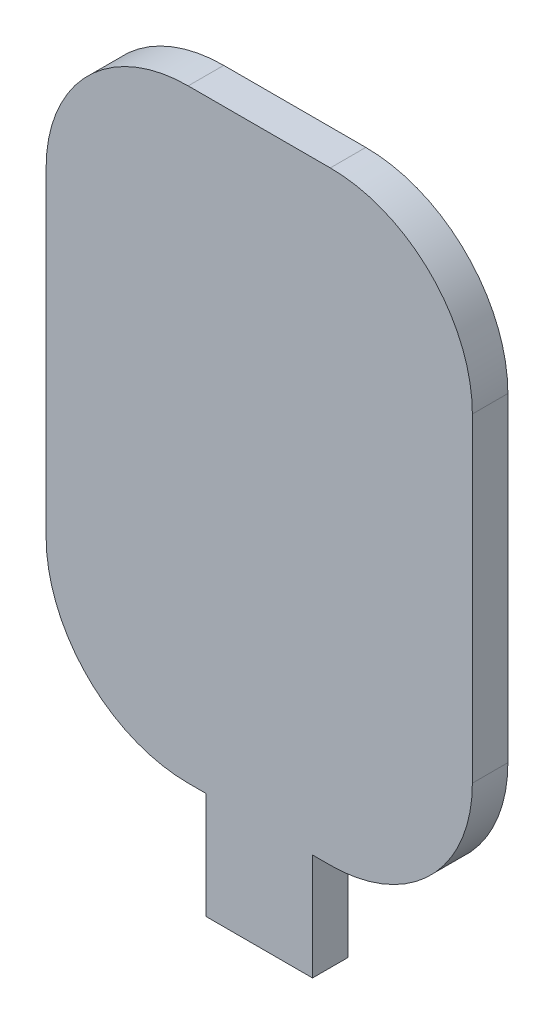
ISO-10303-21;
HEADER;
FILE_DESCRIPTION(('STEP AP214'),'2;1');
FILE_NAME('part.step','',(''),(''),'','','');
FILE_SCHEMA(('AUTOMOTIVE_DESIGN { 1 0 10303 214 1 1 1 1 }'));
ENDSEC;
DATA;
#1=APPLICATION_CONTEXT('core data for automotive mechanical design processes');
#2=APPLICATION_PROTOCOL_DEFINITION('international standard','automotive_design',2000,#1);
#3=PRODUCT_CONTEXT('',#1,'mechanical');
#4=PRODUCT('Part','Part','',(#3));
#5=PRODUCT_RELATED_PRODUCT_CATEGORY('part','',(#4));
#6=PRODUCT_DEFINITION_FORMATION('','',#4);
#7=PRODUCT_DEFINITION_CONTEXT('part definition',#1,'design');
#8=PRODUCT_DEFINITION('design','',#6,#7);
#9=PRODUCT_DEFINITION_SHAPE('','',#8);
#10=(LENGTH_UNIT() NAMED_UNIT(*) SI_UNIT(.MILLI.,.METRE.));
#11=(NAMED_UNIT(*) PLANE_ANGLE_UNIT() SI_UNIT($,.RADIAN.));
#12=(NAMED_UNIT(*) SI_UNIT($,.STERADIAN.) SOLID_ANGLE_UNIT());
#13=UNCERTAINTY_MEASURE_WITH_UNIT(LENGTH_MEASURE(1.E-05),#10,'distance_accuracy_value','');
#14=(GEOMETRIC_REPRESENTATION_CONTEXT(3) GLOBAL_UNCERTAINTY_ASSIGNED_CONTEXT((#13)) GLOBAL_UNIT_ASSIGNED_CONTEXT((#10,
#11,#12)) REPRESENTATION_CONTEXT('',''));
#15=CARTESIAN_POINT('',(0.,0.,0.));
#16=DIRECTION('',(0.,0.,1.));
#17=DIRECTION('',(1.,0.,0.));
#18=AXIS2_PLACEMENT_3D('',#15,#16,#17);
#19=CARTESIAN_POINT('',(0.,0.,3.175));
#20=DIRECTION('',(1.,0.,0.));
#21=DIRECTION('',(0.,0.,-1.));
#22=AXIS2_PLACEMENT_3D('',#19,#20,#21);
#23=PLANE('',#22);
#24=DIRECTION('',(0.,-1.,0.));
#25=VECTOR('',#24,1.);
#26=CARTESIAN_POINT('',(0.,0.,0.));
#27=LINE('',#26,#25);
#28=CARTESIAN_POINT('',(0.,9.525,0.));
#29=VERTEX_POINT('',#28);
#30=CARTESIAN_POINT('',(0.,0.,0.));
#31=VERTEX_POINT('',#30);
#32=EDGE_CURVE('E153',#29,#31,#27,.T.);
#33=ORIENTED_EDGE('',*,*,#32,.T.);
#34=DIRECTION('',(0.,0.,-1.));
#35=VECTOR('',#34,1.);
#36=CARTESIAN_POINT('',(0.,0.,3.175));
#37=LINE('',#36,#35);
#38=CARTESIAN_POINT('',(0.,0.,3.175));
#39=VERTEX_POINT('',#38);
#40=EDGE_CURVE('E11',#39,#31,#37,.T.);
#41=ORIENTED_EDGE('',*,*,#40,.F.);
#42=DIRECTION('',(0.,-1.,0.));
#43=VECTOR('',#42,1.);
#44=CARTESIAN_POINT('',(0.,0.,3.175));
#45=LINE('',#44,#43);
#46=CARTESIAN_POINT('',(0.,9.525,3.175));
#47=VERTEX_POINT('',#46);
#48=EDGE_CURVE('E175',#47,#39,#45,.T.);
#49=ORIENTED_EDGE('',*,*,#48,.F.);
#50=DIRECTION('',(0.,0.,-1.));
#51=VECTOR('',#50,1.);
#52=CARTESIAN_POINT('',(0.,9.525,3.175));
#53=LINE('',#52,#51);
#54=EDGE_CURVE('E149',#47,#29,#53,.T.);
#55=ORIENTED_EDGE('',*,*,#54,.T.);
#56=EDGE_LOOP('',(#33,#41,#49,#55));
#57=FACE_BOUND('',#56,.T.);
#58=ADVANCED_FACE('F33',(#57),#23,.F.);
#59=CARTESIAN_POINT('',(0.,0.,3.175));
#60=DIRECTION('',(0.,1.,0.));
#61=DIRECTION('',(0.,0.,1.));
#62=AXIS2_PLACEMENT_3D('',#59,#60,#61);
#63=PLANE('',#62);
#64=DIRECTION('',(1.,0.,0.));
#65=VECTOR('',#64,1.);
#66=CARTESIAN_POINT('',(0.,0.,0.));
#67=LINE('',#66,#65);
#68=CARTESIAN_POINT('',(9.525,0.,0.));
#69=VERTEX_POINT('',#68);
#70=EDGE_CURVE('E156',#31,#69,#67,.T.);
#71=ORIENTED_EDGE('',*,*,#70,.T.);
#72=DIRECTION('',(0.,0.,-1.));
#73=VECTOR('',#72,1.);
#74=CARTESIAN_POINT('',(9.525,0.,3.175));
#75=LINE('',#74,#73);
#76=CARTESIAN_POINT('',(9.525,0.,3.175));
#77=VERTEX_POINT('',#76);
#78=EDGE_CURVE('E41',#77,#69,#75,.T.);
#79=ORIENTED_EDGE('',*,*,#78,.F.);
#80=DIRECTION('',(1.,0.,0.));
#81=VECTOR('',#80,1.);
#82=CARTESIAN_POINT('',(0.,0.,3.175));
#83=LINE('',#82,#81);
#84=EDGE_CURVE('E104',#39,#77,#83,.T.);
#85=ORIENTED_EDGE('',*,*,#84,.F.);
#86=ORIENTED_EDGE('',*,*,#40,.T.);
#87=EDGE_LOOP('',(#71,#79,#85,#86));
#88=FACE_BOUND('',#87,.T.);
#89=ADVANCED_FACE('F253',(#88),#63,.F.);
#90=CARTESIAN_POINT('',(9.525,0.,3.175));
#91=DIRECTION('',(-1.,0.,0.));
#92=DIRECTION('',(0.,0.,1.));
#93=AXIS2_PLACEMENT_3D('',#90,#91,#92);
#94=PLANE('',#93);
#95=DIRECTION('',(0.,1.,0.));
#96=VECTOR('',#95,1.);
#97=CARTESIAN_POINT('',(9.525,0.,0.));
#98=LINE('',#97,#96);
#99=CARTESIAN_POINT('',(9.525,9.525,0.));
#100=VERTEX_POINT('',#99);
#101=EDGE_CURVE('E158',#69,#100,#98,.T.);
#102=ORIENTED_EDGE('',*,*,#101,.T.);
#103=DIRECTION('',(0.,0.,-1.));
#104=VECTOR('',#103,1.);
#105=CARTESIAN_POINT('',(9.525,9.525,3.175));
#106=LINE('',#105,#104);
#107=CARTESIAN_POINT('',(9.525,9.525,3.175));
#108=VERTEX_POINT('',#107);
#109=EDGE_CURVE('E194',#108,#100,#106,.T.);
#110=ORIENTED_EDGE('',*,*,#109,.F.);
#111=DIRECTION('',(0.,1.,0.));
#112=VECTOR('',#111,1.);
#113=CARTESIAN_POINT('',(9.525,0.,3.175));
#114=LINE('',#113,#112);
#115=EDGE_CURVE('E202',#77,#108,#114,.T.);
#116=ORIENTED_EDGE('',*,*,#115,.F.);
#117=ORIENTED_EDGE('',*,*,#78,.T.);
#118=EDGE_LOOP('',(#102,#110,#116,#117));
#119=FACE_BOUND('',#118,.T.);
#120=ADVANCED_FACE('F200',(#119),#94,.F.);
#121=CARTESIAN_POINT('',(9.525,9.525,3.175));
#122=DIRECTION('',(0.,1.,0.));
#123=DIRECTION('',(0.,0.,1.));
#124=AXIS2_PLACEMENT_3D('',#121,#122,#123);
#125=PLANE('',#124);
#126=DIRECTION('',(1.,0.,0.));
#127=VECTOR('',#126,1.);
#128=CARTESIAN_POINT('',(9.525,9.525,0.));
#129=LINE('',#128,#127);
#130=CARTESIAN_POINT('',(11.1124999999999,9.525,0.));
#131=VERTEX_POINT('',#130);
#132=EDGE_CURVE('E160',#100,#131,#129,.T.);
#133=ORIENTED_EDGE('',*,*,#132,.T.);
#134=DIRECTION('',(0.,0.,-1.));
#135=VECTOR('',#134,1.);
#136=CARTESIAN_POINT('',(11.1124999999999,9.525,3.175));
#137=LINE('',#136,#135);
#138=CARTESIAN_POINT('',(11.1124999999999,9.525,3.175));
#139=VERTEX_POINT('',#138);
#140=EDGE_CURVE('E191',#139,#131,#137,.T.);
#141=ORIENTED_EDGE('',*,*,#140,.F.);
#142=DIRECTION('',(1.,0.,0.));
#143=VECTOR('',#142,1.);
#144=CARTESIAN_POINT('',(9.525,9.525,3.175));
#145=LINE('',#144,#143);
#146=EDGE_CURVE('E220',#108,#139,#145,.T.);
#147=ORIENTED_EDGE('',*,*,#146,.F.);
#148=ORIENTED_EDGE('',*,*,#109,.T.);
#149=EDGE_LOOP('',(#133,#141,#147,#148));
#150=FACE_BOUND('',#149,.T.);
#151=ADVANCED_FACE('F211',(#150),#125,.F.);
#152=CARTESIAN_POINT('',(11.1125,22.225,3.175));
#153=DIRECTION('',(0.,0.,-1.));
#154=DIRECTION('',(-1.,0.,0.));
#155=AXIS2_PLACEMENT_3D('',#152,#153,#154);
#156=CYLINDRICAL_SURFACE('',#155,12.7);
#157=CARTESIAN_POINT('',(11.1125,22.225,0.));
#158=DIRECTION('',(0.,0.,1.));
#159=DIRECTION('',(-1.,0.,0.));
#160=AXIS2_PLACEMENT_3D('',#157,#158,#159);
#161=CIRCLE('',#160,12.7);
#162=CARTESIAN_POINT('',(23.8125,22.2250000000001,0.));
#163=VERTEX_POINT('',#162);
#164=EDGE_CURVE('E162',#131,#163,#161,.T.);
#165=ORIENTED_EDGE('',*,*,#164,.T.);
#166=DIRECTION('',(0.,0.,-1.));
#167=VECTOR('',#166,1.);
#168=CARTESIAN_POINT('',(23.8125,22.2250000000001,3.175));
#169=LINE('',#168,#167);
#170=CARTESIAN_POINT('',(23.8125,22.2250000000001,3.175));
#171=VERTEX_POINT('',#170);
#172=EDGE_CURVE('E188',#171,#163,#169,.T.);
#173=ORIENTED_EDGE('',*,*,#172,.F.);
#174=CARTESIAN_POINT('',(11.1125,22.225,3.175));
#175=DIRECTION('',(0.,0.,1.));
#176=DIRECTION('',(-1.,0.,0.));
#177=AXIS2_PLACEMENT_3D('',#174,#175,#176);
#178=CIRCLE('',#177,12.7);
#179=EDGE_CURVE('E217',#139,#171,#178,.T.);
#180=ORIENTED_EDGE('',*,*,#179,.F.);
#181=ORIENTED_EDGE('',*,*,#140,.T.);
#182=EDGE_LOOP('',(#165,#173,#180,#181));
#183=FACE_BOUND('',#182,.T.);
#184=ADVANCED_FACE('F215',(#183),#156,.T.);
#185=CARTESIAN_POINT('',(23.8125,22.2250000000001,3.175));
#186=DIRECTION('',(-1.,0.,0.));
#187=DIRECTION('',(0.,0.,1.));
#188=AXIS2_PLACEMENT_3D('',#185,#186,#187);
#189=PLANE('',#188);
#190=DIRECTION('',(0.,1.,0.));
#191=VECTOR('',#190,1.);
#192=CARTESIAN_POINT('',(23.8125,22.2250000000001,0.));
#193=LINE('',#192,#191);
#194=CARTESIAN_POINT('',(23.8125,50.7999999999999,0.));
#195=VERTEX_POINT('',#194);
#196=EDGE_CURVE('E164',#163,#195,#193,.T.);
#197=ORIENTED_EDGE('',*,*,#196,.T.);
#198=DIRECTION('',(0.,0.,-1.));
#199=VECTOR('',#198,1.);
#200=CARTESIAN_POINT('',(23.8125,50.7999999999999,3.175));
#201=LINE('',#200,#199);
#202=CARTESIAN_POINT('',(23.8125,50.7999999999999,3.175));
#203=VERTEX_POINT('',#202);
#204=EDGE_CURVE('E185',#203,#195,#201,.T.);
#205=ORIENTED_EDGE('',*,*,#204,.F.);
#206=DIRECTION('',(0.,1.,0.));
#207=VECTOR('',#206,1.);
#208=CARTESIAN_POINT('',(23.8125,22.2250000000001,3.175));
#209=LINE('',#208,#207);
#210=EDGE_CURVE('E219',#171,#203,#209,.T.);
#211=ORIENTED_EDGE('',*,*,#210,.F.);
#212=ORIENTED_EDGE('',*,*,#172,.T.);
#213=EDGE_LOOP('',(#197,#205,#211,#212));
#214=FACE_BOUND('',#213,.T.);
#215=ADVANCED_FACE('F266',(#214),#189,.F.);
#216=CARTESIAN_POINT('',(11.1125,50.8,3.175));
#217=DIRECTION('',(0.,0.,-1.));
#218=DIRECTION('',(-1.,0.,0.));
#219=AXIS2_PLACEMENT_3D('',#216,#217,#218);
#220=CYLINDRICAL_SURFACE('',#219,12.7);
#221=CARTESIAN_POINT('',(11.1125,50.8,0.));
#222=DIRECTION('',(0.,0.,1.));
#223=DIRECTION('',(-1.,0.,0.));
#224=AXIS2_PLACEMENT_3D('',#221,#222,#223);
#225=CIRCLE('',#224,12.7);
#226=CARTESIAN_POINT('',(11.1124999999999,63.5,0.));
#227=VERTEX_POINT('',#226);
#228=EDGE_CURVE('E166',#195,#227,#225,.T.);
#229=ORIENTED_EDGE('',*,*,#228,.T.);
#230=DIRECTION('',(0.,0.,-1.));
#231=VECTOR('',#230,1.);
#232=CARTESIAN_POINT('',(11.1124999999999,63.5,3.175));
#233=LINE('',#232,#231);
#234=CARTESIAN_POINT('',(11.1124999999999,63.5,3.175));
#235=VERTEX_POINT('',#234);
#236=EDGE_CURVE('E182',#235,#227,#233,.T.);
#237=ORIENTED_EDGE('',*,*,#236,.F.);
#238=CARTESIAN_POINT('',(11.1125,50.8,3.175));
#239=DIRECTION('',(0.,0.,1.));
#240=DIRECTION('',(-1.,0.,0.));
#241=AXIS2_PLACEMENT_3D('',#238,#239,#240);
#242=CIRCLE('',#241,12.7);
#243=EDGE_CURVE('E222',#203,#235,#242,.T.);
#244=ORIENTED_EDGE('',*,*,#243,.F.);
#245=ORIENTED_EDGE('',*,*,#204,.T.);
#246=EDGE_LOOP('',(#229,#237,#244,#245));
#247=FACE_BOUND('',#246,.T.);
#248=ADVANCED_FACE('F269',(#247),#220,.T.);
#249=CARTESIAN_POINT('',(-1.58749999999993,63.5,3.175));
#250=DIRECTION('',(0.,-1.,0.));
#251=DIRECTION('',(0.,0.,-1.));
#252=AXIS2_PLACEMENT_3D('',#249,#250,#251);
#253=PLANE('',#252);
#254=DIRECTION('',(-1.,0.,0.));
#255=VECTOR('',#254,1.);
#256=CARTESIAN_POINT('',(-1.58749999999993,63.5,0.));
#257=LINE('',#256,#255);
#258=CARTESIAN_POINT('',(-1.58749999999993,63.5,0.));
#259=VERTEX_POINT('',#258);
#260=EDGE_CURVE('E168',#227,#259,#257,.T.);
#261=ORIENTED_EDGE('',*,*,#260,.T.);
#262=DIRECTION('',(0.,0.,-1.));
#263=VECTOR('',#262,1.);
#264=CARTESIAN_POINT('',(-1.58749999999993,63.5,3.175));
#265=LINE('',#264,#263);
#266=CARTESIAN_POINT('',(-1.58749999999993,63.5,3.175));
#267=VERTEX_POINT('',#266);
#268=EDGE_CURVE('E179',#267,#259,#265,.T.);
#269=ORIENTED_EDGE('',*,*,#268,.F.);
#270=DIRECTION('',(-1.,0.,0.));
#271=VECTOR('',#270,1.);
#272=CARTESIAN_POINT('',(-1.58749999999993,63.5,3.175));
#273=LINE('',#272,#271);
#274=EDGE_CURVE('E228',#235,#267,#273,.T.);
#275=ORIENTED_EDGE('',*,*,#274,.F.);
#276=ORIENTED_EDGE('',*,*,#236,.T.);
#277=EDGE_LOOP('',(#261,#269,#275,#276));
#278=FACE_BOUND('',#277,.T.);
#279=ADVANCED_FACE('F234',(#278),#253,.F.);
#280=CARTESIAN_POINT('',(-1.58750000000002,50.8,3.175));
#281=DIRECTION('',(0.,0.,-1.));
#282=DIRECTION('',(-1.,0.,0.));
#283=AXIS2_PLACEMENT_3D('',#280,#281,#282);
#284=CYLINDRICAL_SURFACE('',#283,12.7);
#285=CARTESIAN_POINT('',(-1.58750000000002,50.8,0.));
#286=DIRECTION('',(0.,0.,1.));
#287=DIRECTION('',(-1.,0.,0.));
#288=AXIS2_PLACEMENT_3D('',#285,#286,#287);
#289=CIRCLE('',#288,12.7);
#290=CARTESIAN_POINT('',(-14.2875,50.7999999999999,0.));
#291=VERTEX_POINT('',#290);
#292=EDGE_CURVE('E170',#259,#291,#289,.T.);
#293=ORIENTED_EDGE('',*,*,#292,.T.);
#294=DIRECTION('',(0.,0.,-1.));
#295=VECTOR('',#294,1.);
#296=CARTESIAN_POINT('',(-14.2875,50.7999999999999,3.175));
#297=LINE('',#296,#295);
#298=CARTESIAN_POINT('',(-14.2875,50.7999999999999,3.175));
#299=VERTEX_POINT('',#298);
#300=EDGE_CURVE('E144',#299,#291,#297,.T.);
#301=ORIENTED_EDGE('',*,*,#300,.F.);
#302=CARTESIAN_POINT('',(-1.58750000000002,50.8,3.175));
#303=DIRECTION('',(0.,0.,1.));
#304=DIRECTION('',(-1.,0.,0.));
#305=AXIS2_PLACEMENT_3D('',#302,#303,#304);
#306=CIRCLE('',#305,12.7);
#307=EDGE_CURVE('E135',#267,#299,#306,.T.);
#308=ORIENTED_EDGE('',*,*,#307,.F.);
#309=ORIENTED_EDGE('',*,*,#268,.T.);
#310=EDGE_LOOP('',(#293,#301,#308,#309));
#311=FACE_BOUND('',#310,.T.);
#312=ADVANCED_FACE('F238',(#311),#284,.T.);
#313=CARTESIAN_POINT('',(-14.2875,22.2250000000001,3.175));
#314=DIRECTION('',(1.,0.,0.));
#315=DIRECTION('',(0.,1.,0.));
#316=AXIS2_PLACEMENT_3D('',#313,#314,#315);
#317=PLANE('',#316);
#318=DIRECTION('',(0.,-1.,0.));
#319=VECTOR('',#318,1.);
#320=CARTESIAN_POINT('',(-14.2875,22.2250000000001,0.));
#321=LINE('',#320,#319);
#322=CARTESIAN_POINT('',(-14.2875,22.2250000000001,0.));
#323=VERTEX_POINT('',#322);
#324=EDGE_CURVE('E143',#291,#323,#321,.T.);
#325=ORIENTED_EDGE('',*,*,#324,.T.);
#326=DIRECTION('',(0.,0.,-1.));
#327=VECTOR('',#326,1.);
#328=CARTESIAN_POINT('',(-14.2875,22.2250000000001,3.175));
#329=LINE('',#328,#327);
#330=CARTESIAN_POINT('',(-14.2875,22.2250000000001,3.175));
#331=VERTEX_POINT('',#330);
#332=EDGE_CURVE('E140',#331,#323,#329,.T.);
#333=ORIENTED_EDGE('',*,*,#332,.F.);
#334=DIRECTION('',(0.,-1.,0.));
#335=VECTOR('',#334,1.);
#336=CARTESIAN_POINT('',(-14.2875,22.2250000000001,3.175));
#337=LINE('',#336,#335);
#338=EDGE_CURVE('E129',#299,#331,#337,.T.);
#339=ORIENTED_EDGE('',*,*,#338,.F.);
#340=ORIENTED_EDGE('',*,*,#300,.T.);
#341=EDGE_LOOP('',(#325,#333,#339,#340));
#342=FACE_BOUND('',#341,.T.);
#343=ADVANCED_FACE('F141',(#342),#317,.F.);
#344=CARTESIAN_POINT('',(-1.5875,22.225,3.175));
#345=DIRECTION('',(0.,0.,-1.));
#346=DIRECTION('',(-1.,0.,0.));
#347=AXIS2_PLACEMENT_3D('',#344,#345,#346);
#348=CYLINDRICAL_SURFACE('',#347,12.7);
#349=CARTESIAN_POINT('',(-1.5875,22.225,0.));
#350=DIRECTION('',(0.,0.,1.));
#351=DIRECTION('',(1.,0.,0.));
#352=AXIS2_PLACEMENT_3D('',#349,#350,#351);
#353=CIRCLE('',#352,12.7);
#354=CARTESIAN_POINT('',(-1.58749999999992,9.525,0.));
#355=VERTEX_POINT('',#354);
#356=EDGE_CURVE('E90',#323,#355,#353,.T.);
#357=ORIENTED_EDGE('',*,*,#356,.T.);
#358=DIRECTION('',(0.,0.,-1.));
#359=VECTOR('',#358,1.);
#360=CARTESIAN_POINT('',(-1.58749999999992,9.525,3.175));
#361=LINE('',#360,#359);
#362=CARTESIAN_POINT('',(-1.58749999999992,9.525,3.175));
#363=VERTEX_POINT('',#362);
#364=EDGE_CURVE('E145',#363,#355,#361,.T.);
#365=ORIENTED_EDGE('',*,*,#364,.F.);
#366=CARTESIAN_POINT('',(-1.5875,22.225,3.175));
#367=DIRECTION('',(0.,0.,1.));
#368=DIRECTION('',(1.,0.,0.));
#369=AXIS2_PLACEMENT_3D('',#366,#367,#368);
#370=CIRCLE('',#369,12.7);
#371=EDGE_CURVE('E133',#331,#363,#370,.T.);
#372=ORIENTED_EDGE('',*,*,#371,.F.);
#373=ORIENTED_EDGE('',*,*,#332,.T.);
#374=EDGE_LOOP('',(#357,#365,#372,#373));
#375=FACE_BOUND('',#374,.T.);
#376=ADVANCED_FACE('F147',(#375),#348,.T.);
#377=CARTESIAN_POINT('',(-1.58749999999991,9.525,3.175));
#378=DIRECTION('',(0.,1.,0.));
#379=DIRECTION('',(0.,0.,1.));
#380=AXIS2_PLACEMENT_3D('',#377,#378,#379);
#381=PLANE('',#380);
#382=DIRECTION('',(1.,0.,0.));
#383=VECTOR('',#382,1.);
#384=CARTESIAN_POINT('',(-1.58749999999991,9.525,0.));
#385=LINE('',#384,#383);
#386=EDGE_CURVE('E96',#355,#29,#385,.T.);
#387=ORIENTED_EDGE('',*,*,#386,.T.);
#388=ORIENTED_EDGE('',*,*,#54,.F.);
#389=DIRECTION('',(1.,0.,0.));
#390=VECTOR('',#389,1.);
#391=CARTESIAN_POINT('',(-1.58749999999991,9.525,3.175));
#392=LINE('',#391,#390);
#393=EDGE_CURVE('E49',#363,#47,#392,.T.);
#394=ORIENTED_EDGE('',*,*,#393,.F.);
#395=ORIENTED_EDGE('',*,*,#364,.T.);
#396=EDGE_LOOP('',(#387,#388,#394,#395));
#397=FACE_BOUND('',#396,.T.);
#398=ADVANCED_FACE('F242',(#397),#381,.F.);
#399=CARTESIAN_POINT('',(-1.5875,22.225,3.175));
#400=DIRECTION('',(0.,0.,1.));
#401=DIRECTION('',(1.,0.,0.));
#402=AXIS2_PLACEMENT_3D('',#399,#400,#401);
#403=PLANE('',#402);
#404=ORIENTED_EDGE('',*,*,#48,.T.);
#405=ORIENTED_EDGE('',*,*,#84,.T.);
#406=ORIENTED_EDGE('',*,*,#115,.T.);
#407=ORIENTED_EDGE('',*,*,#146,.T.);
#408=ORIENTED_EDGE('',*,*,#179,.T.);
#409=ORIENTED_EDGE('',*,*,#210,.T.);
#410=ORIENTED_EDGE('',*,*,#243,.T.);
#411=ORIENTED_EDGE('',*,*,#274,.T.);
#412=ORIENTED_EDGE('',*,*,#307,.T.);
#413=ORIENTED_EDGE('',*,*,#338,.T.);
#414=ORIENTED_EDGE('',*,*,#371,.T.);
#415=ORIENTED_EDGE('',*,*,#393,.T.);
#416=EDGE_LOOP('',(#404,#405,#406,#407,#408,#409,#410,#411,#412,#413,#414,#415));
#417=FACE_BOUND('',#416,.T.);
#418=ADVANCED_FACE('F131',(#417),#403,.T.);
#419=CARTESIAN_POINT('',(-1.5875,22.225,0.));
#420=DIRECTION('',(0.,0.,1.));
#421=DIRECTION('',(1.,0.,0.));
#422=AXIS2_PLACEMENT_3D('',#419,#420,#421);
#423=PLANE('',#422);
#424=ORIENTED_EDGE('',*,*,#32,.F.);
#425=ORIENTED_EDGE('',*,*,#386,.F.);
#426=ORIENTED_EDGE('',*,*,#356,.F.);
#427=ORIENTED_EDGE('',*,*,#324,.F.);
#428=ORIENTED_EDGE('',*,*,#292,.F.);
#429=ORIENTED_EDGE('',*,*,#260,.F.);
#430=ORIENTED_EDGE('',*,*,#228,.F.);
#431=ORIENTED_EDGE('',*,*,#196,.F.);
#432=ORIENTED_EDGE('',*,*,#164,.F.);
#433=ORIENTED_EDGE('',*,*,#132,.F.);
#434=ORIENTED_EDGE('',*,*,#101,.F.);
#435=ORIENTED_EDGE('',*,*,#70,.F.);
#436=EDGE_LOOP('',(#424,#425,#426,#427,#428,#429,#430,#431,#432,#433,#434,#435));
#437=FACE_BOUND('',#436,.T.);
#438=ADVANCED_FACE('F206',(#437),#423,.F.);
#439=CLOSED_SHELL('',(#58,#89,#120,#151,#184,#215,#248,#279,#312,#343,#376,#398,#418,#438));
#440=MANIFOLD_SOLID_BREP('B2',#439);
#441=ADVANCED_BREP_SHAPE_REPRESENTATION('',(#18,#440),#14);
#442=SHAPE_DEFINITION_REPRESENTATION(#9,#441);
ENDSEC;
END-ISO-10303-21;
